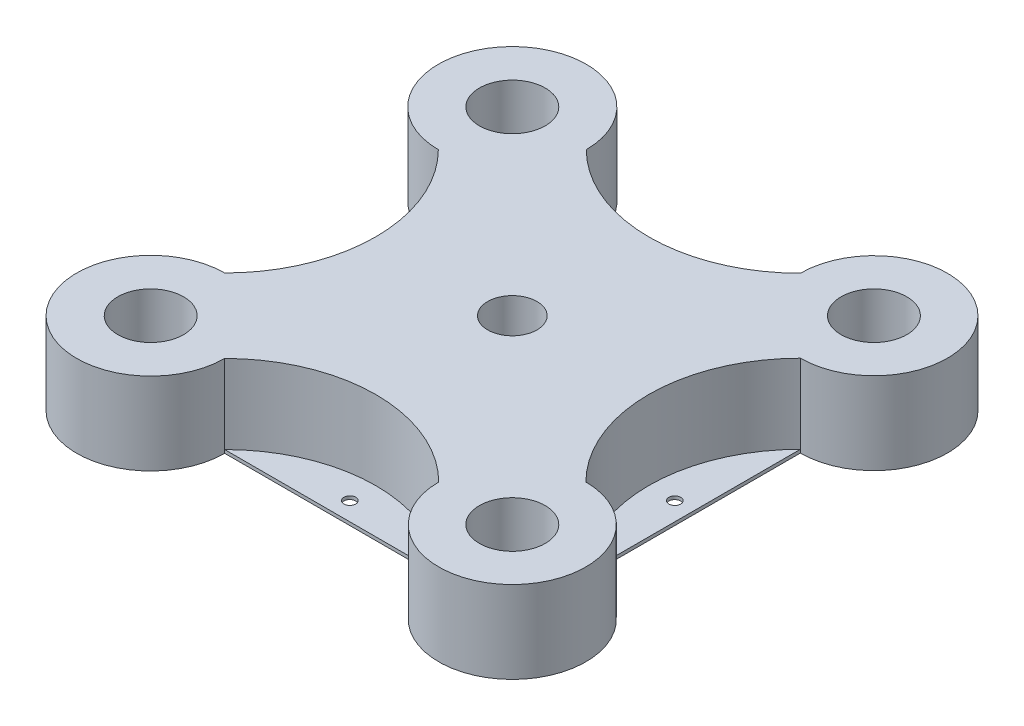
ISO-10303-21;
HEADER;
FILE_DESCRIPTION(('STEP AP214'),'2;1');
FILE_NAME('part.step','',(''),(''),'','','');
FILE_SCHEMA(('AUTOMOTIVE_DESIGN { 1 0 10303 214 1 1 1 1 }'));
ENDSEC;
DATA;
#1=APPLICATION_CONTEXT('core data for automotive mechanical design processes');
#2=APPLICATION_PROTOCOL_DEFINITION('international standard','automotive_design',2000,#1);
#3=PRODUCT_CONTEXT('',#1,'mechanical');
#4=PRODUCT('Part','Part','',(#3));
#5=PRODUCT_RELATED_PRODUCT_CATEGORY('part','',(#4));
#6=PRODUCT_DEFINITION_FORMATION('','',#4);
#7=PRODUCT_DEFINITION_CONTEXT('part definition',#1,'design');
#8=PRODUCT_DEFINITION('design','',#6,#7);
#9=PRODUCT_DEFINITION_SHAPE('','',#8);
#10=(LENGTH_UNIT() NAMED_UNIT(*) SI_UNIT(.MILLI.,.METRE.));
#11=(NAMED_UNIT(*) PLANE_ANGLE_UNIT() SI_UNIT($,.RADIAN.));
#12=(NAMED_UNIT(*) SI_UNIT($,.STERADIAN.) SOLID_ANGLE_UNIT());
#13=UNCERTAINTY_MEASURE_WITH_UNIT(LENGTH_MEASURE(1.E-05),#10,'distance_accuracy_value','');
#14=(GEOMETRIC_REPRESENTATION_CONTEXT(3) GLOBAL_UNCERTAINTY_ASSIGNED_CONTEXT((#13)) GLOBAL_UNIT_ASSIGNED_CONTEXT((#10,
#11,#12)) REPRESENTATION_CONTEXT('',''));
#15=CARTESIAN_POINT('',(0.,0.,0.));
#16=DIRECTION('',(0.,0.,1.));
#17=DIRECTION('',(1.,0.,0.));
#18=AXIS2_PLACEMENT_3D('',#15,#16,#17);
#19=CARTESIAN_POINT('',(550.,250.,0.));
#20=DIRECTION('',(1.,0.,0.));
#21=DIRECTION('',(0.,0.,-1.));
#22=AXIS2_PLACEMENT_3D('',#19,#20,#21);
#23=PLANE('',#22);
#24=DIRECTION('',(0.,-1.,0.));
#25=VECTOR('',#24,1.);
#26=CARTESIAN_POINT('',(550.,250.,-326.203305187064));
#27=LINE('',#26,#25);
#28=CARTESIAN_POINT('',(550.,10.0000000000001,-326.203305187064));
#29=VERTEX_POINT('',#28);
#30=CARTESIAN_POINT('',(550.,0.,-326.203305187064));
#31=VERTEX_POINT('',#30);
#32=EDGE_CURVE('E218',#29,#31,#27,.T.);
#33=ORIENTED_EDGE('',*,*,#32,.F.);
#34=DIRECTION('',(0.,0.,-1.));
#35=VECTOR('',#34,1.);
#36=CARTESIAN_POINT('',(550.,10.0000000000001,-326.203305187064));
#37=LINE('',#36,#35);
#38=CARTESIAN_POINT('',(550.,10.0000000000001,326.203305187064));
#39=VERTEX_POINT('',#38);
#40=EDGE_CURVE('E212',#39,#29,#37,.T.);
#41=ORIENTED_EDGE('',*,*,#40,.F.);
#42=DIRECTION('',(0.,-1.,0.));
#43=VECTOR('',#42,1.);
#44=CARTESIAN_POINT('',(550.,250.,326.203305187064));
#45=LINE('',#44,#43);
#46=CARTESIAN_POINT('',(550.,0.,326.203305187064));
#47=VERTEX_POINT('',#46);
#48=EDGE_CURVE('E207',#39,#47,#45,.T.);
#49=ORIENTED_EDGE('',*,*,#48,.T.);
#50=DIRECTION('',(0.,0.,1.));
#51=VECTOR('',#50,1.);
#52=CARTESIAN_POINT('',(550.,0.,0.));
#53=LINE('',#52,#51);
#54=EDGE_CURVE('E296',#31,#47,#53,.T.);
#55=ORIENTED_EDGE('',*,*,#54,.F.);
#56=EDGE_LOOP('',(#33,#41,#49,#55));
#57=FACE_BOUND('',#56,.T.);
#58=ADVANCED_FACE('F95',(#57),#23,.T.);
#59=CARTESIAN_POINT('',(0.,250.,-550.));
#60=DIRECTION('',(0.,0.,-1.));
#61=DIRECTION('',(-1.,0.,0.));
#62=AXIS2_PLACEMENT_3D('',#59,#60,#61);
#63=PLANE('',#62);
#64=DIRECTION('',(0.,-1.,0.));
#65=VECTOR('',#64,1.);
#66=CARTESIAN_POINT('',(-325.,250.,-550.));
#67=LINE('',#66,#65);
#68=CARTESIAN_POINT('',(-325.,10.0000000000001,-550.));
#69=VERTEX_POINT('',#68);
#70=CARTESIAN_POINT('',(-325.,0.,-550.));
#71=VERTEX_POINT('',#70);
#72=EDGE_CURVE('E325',#69,#71,#67,.T.);
#73=ORIENTED_EDGE('',*,*,#72,.F.);
#74=DIRECTION('',(-1.,0.,0.));
#75=VECTOR('',#74,1.);
#76=CARTESIAN_POINT('',(-325.,10.0000000000001,-550.));
#77=LINE('',#76,#75);
#78=CARTESIAN_POINT('',(326.203305187064,10.0000000000001,-550.));
#79=VERTEX_POINT('',#78);
#80=EDGE_CURVE('E337',#79,#69,#77,.T.);
#81=ORIENTED_EDGE('',*,*,#80,.F.);
#82=DIRECTION('',(0.,-1.,0.));
#83=VECTOR('',#82,1.);
#84=CARTESIAN_POINT('',(326.203305187064,250.,-550.));
#85=LINE('',#84,#83);
#86=CARTESIAN_POINT('',(326.203305187064,0.,-550.));
#87=VERTEX_POINT('',#86);
#88=EDGE_CURVE('E326',#79,#87,#85,.T.);
#89=ORIENTED_EDGE('',*,*,#88,.T.);
#90=DIRECTION('',(1.,0.,0.));
#91=VECTOR('',#90,1.);
#92=CARTESIAN_POINT('',(0.,0.,-550.));
#93=LINE('',#92,#91);
#94=EDGE_CURVE('E301',#71,#87,#93,.T.);
#95=ORIENTED_EDGE('',*,*,#94,.F.);
#96=EDGE_LOOP('',(#73,#81,#89,#95));
#97=FACE_BOUND('',#96,.T.);
#98=ADVANCED_FACE('F335',(#97),#63,.T.);
#99=CARTESIAN_POINT('',(550.,250.,550.));
#100=DIRECTION('',(0.,-1.,0.));
#101=DIRECTION('',(0.,0.,-1.));
#102=AXIS2_PLACEMENT_3D('',#99,#100,#101);
#103=CYLINDRICAL_SURFACE('',#102,100.);
#104=CARTESIAN_POINT('',(550.,250.,550.));
#105=DIRECTION('',(0.,1.,0.));
#106=DIRECTION('',(0.,0.,1.));
#107=AXIS2_PLACEMENT_3D('',#104,#105,#106);
#108=CIRCLE('',#107,100.);
#109=CARTESIAN_POINT('',(550.,250.,650.));
#110=VERTEX_POINT('',#109);
#111=EDGE_CURVE('E292',#110,#110,#108,.T.);
#112=ORIENTED_EDGE('',*,*,#111,.T.);
#113=EDGE_LOOP('',(#112));
#114=FACE_BOUND('',#113,.T.);
#115=CARTESIAN_POINT('',(550.,0.,550.));
#116=DIRECTION('',(0.,1.,0.));
#117=DIRECTION('',(0.,0.,1.));
#118=AXIS2_PLACEMENT_3D('',#115,#116,#117);
#119=CIRCLE('',#118,100.);
#120=CARTESIAN_POINT('',(550.,0.,650.));
#121=VERTEX_POINT('',#120);
#122=EDGE_CURVE('E277',#121,#121,#119,.T.);
#123=ORIENTED_EDGE('',*,*,#122,.F.);
#124=EDGE_LOOP('',(#123));
#125=FACE_BOUND('',#124,.T.);
#126=ADVANCED_FACE('F369',(#114,#125),#103,.F.);
#127=CARTESIAN_POINT('',(550.,250.,-550.));
#128=DIRECTION('',(0.,-1.,0.));
#129=DIRECTION('',(0.,0.,-1.));
#130=AXIS2_PLACEMENT_3D('',#127,#128,#129);
#131=CYLINDRICAL_SURFACE('',#130,100.);
#132=CARTESIAN_POINT('',(550.,250.,-550.));
#133=DIRECTION('',(0.,1.,0.));
#134=DIRECTION('',(0.,0.,1.));
#135=AXIS2_PLACEMENT_3D('',#132,#133,#134);
#136=CIRCLE('',#135,100.);
#137=CARTESIAN_POINT('',(550.,250.,-450.));
#138=VERTEX_POINT('',#137);
#139=EDGE_CURVE('E289',#138,#138,#136,.T.);
#140=ORIENTED_EDGE('',*,*,#139,.T.);
#141=EDGE_LOOP('',(#140));
#142=FACE_BOUND('',#141,.T.);
#143=CARTESIAN_POINT('',(550.,0.,-550.));
#144=DIRECTION('',(0.,1.,0.));
#145=DIRECTION('',(0.,0.,1.));
#146=AXIS2_PLACEMENT_3D('',#143,#144,#145);
#147=CIRCLE('',#146,100.);
#148=CARTESIAN_POINT('',(550.,0.,-450.));
#149=VERTEX_POINT('',#148);
#150=EDGE_CURVE('E315',#149,#149,#147,.T.);
#151=ORIENTED_EDGE('',*,*,#150,.F.);
#152=EDGE_LOOP('',(#151));
#153=FACE_BOUND('',#152,.T.);
#154=ADVANCED_FACE('F404',(#142,#153),#131,.F.);
#155=CARTESIAN_POINT('',(-550.,250.,-550.));
#156=DIRECTION('',(0.,-1.,0.));
#157=DIRECTION('',(0.,0.,-1.));
#158=AXIS2_PLACEMENT_3D('',#155,#156,#157);
#159=CYLINDRICAL_SURFACE('',#158,100.);
#160=CARTESIAN_POINT('',(-550.,250.,-550.));
#161=DIRECTION('',(0.,1.,0.));
#162=DIRECTION('',(0.,0.,1.));
#163=AXIS2_PLACEMENT_3D('',#160,#161,#162);
#164=CIRCLE('',#163,100.);
#165=CARTESIAN_POINT('',(-550.,250.,-450.));
#166=VERTEX_POINT('',#165);
#167=EDGE_CURVE('E286',#166,#166,#164,.T.);
#168=ORIENTED_EDGE('',*,*,#167,.T.);
#169=EDGE_LOOP('',(#168));
#170=FACE_BOUND('',#169,.T.);
#171=CARTESIAN_POINT('',(-550.,0.,-550.));
#172=DIRECTION('',(0.,1.,0.));
#173=DIRECTION('',(0.,0.,1.));
#174=AXIS2_PLACEMENT_3D('',#171,#172,#173);
#175=CIRCLE('',#174,100.);
#176=CARTESIAN_POINT('',(-550.,0.,-450.));
#177=VERTEX_POINT('',#176);
#178=EDGE_CURVE('E312',#177,#177,#175,.T.);
#179=ORIENTED_EDGE('',*,*,#178,.F.);
#180=EDGE_LOOP('',(#179));
#181=FACE_BOUND('',#180,.T.);
#182=ADVANCED_FACE('F408',(#170,#181),#159,.F.);
#183=CARTESIAN_POINT('',(0.,250.,0.));
#184=DIRECTION('',(0.,-1.,0.));
#185=DIRECTION('',(0.,0.,-1.));
#186=AXIS2_PLACEMENT_3D('',#183,#184,#185);
#187=CYLINDRICAL_SURFACE('',#186,75.);
#188=CARTESIAN_POINT('',(0.,250.,0.));
#189=DIRECTION('',(0.,1.,0.));
#190=DIRECTION('',(0.,0.,1.));
#191=AXIS2_PLACEMENT_3D('',#188,#189,#190);
#192=CIRCLE('',#191,75.);
#193=CARTESIAN_POINT('',(0.,250.,75.));
#194=VERTEX_POINT('',#193);
#195=EDGE_CURVE('E283',#194,#194,#192,.T.);
#196=ORIENTED_EDGE('',*,*,#195,.T.);
#197=EDGE_LOOP('',(#196));
#198=FACE_BOUND('',#197,.T.);
#199=CARTESIAN_POINT('',(0.,0.,0.));
#200=DIRECTION('',(0.,1.,0.));
#201=DIRECTION('',(0.,0.,1.));
#202=AXIS2_PLACEMENT_3D('',#199,#200,#201);
#203=CIRCLE('',#202,75.);
#204=CARTESIAN_POINT('',(0.,0.,75.));
#205=VERTEX_POINT('',#204);
#206=EDGE_CURVE('E309',#205,#205,#203,.T.);
#207=ORIENTED_EDGE('',*,*,#206,.F.);
#208=EDGE_LOOP('',(#207));
#209=FACE_BOUND('',#208,.T.);
#210=ADVANCED_FACE('F376',(#198,#209),#187,.F.);
#211=CARTESIAN_POINT('',(0.,250.,550.));
#212=DIRECTION('',(0.,0.,-1.));
#213=DIRECTION('',(-1.,0.,0.));
#214=AXIS2_PLACEMENT_3D('',#211,#212,#213);
#215=PLANE('',#214);
#216=DIRECTION('',(0.,-1.,0.));
#217=VECTOR('',#216,1.);
#218=CARTESIAN_POINT('',(326.203305187064,250.,550.));
#219=LINE('',#218,#217);
#220=CARTESIAN_POINT('',(326.203305187064,10.0000000000001,550.));
#221=VERTEX_POINT('',#220);
#222=CARTESIAN_POINT('',(326.203305187064,0.,550.));
#223=VERTEX_POINT('',#222);
#224=EDGE_CURVE('E206',#221,#223,#219,.T.);
#225=ORIENTED_EDGE('',*,*,#224,.F.);
#226=DIRECTION('',(1.,0.,0.));
#227=VECTOR('',#226,1.);
#228=CARTESIAN_POINT('',(-324.872993427457,10.0000000000001,550.));
#229=LINE('',#228,#227);
#230=CARTESIAN_POINT('',(-324.872993427457,10.0000000000001,550.));
#231=VERTEX_POINT('',#230);
#232=EDGE_CURVE('E258',#231,#221,#229,.T.);
#233=ORIENTED_EDGE('',*,*,#232,.F.);
#234=DIRECTION('',(0.,-1.,0.));
#235=VECTOR('',#234,1.);
#236=CARTESIAN_POINT('',(-324.872993427457,250.,550.));
#237=LINE('',#236,#235);
#238=CARTESIAN_POINT('',(-324.872993427457,0.,550.));
#239=VERTEX_POINT('',#238);
#240=EDGE_CURVE('E104',#231,#239,#237,.T.);
#241=ORIENTED_EDGE('',*,*,#240,.T.);
#242=DIRECTION('',(1.,0.,0.));
#243=VECTOR('',#242,1.);
#244=CARTESIAN_POINT('',(0.,0.,550.));
#245=LINE('',#244,#243);
#246=EDGE_CURVE('E240',#239,#223,#245,.T.);
#247=ORIENTED_EDGE('',*,*,#246,.T.);
#248=EDGE_LOOP('',(#225,#233,#241,#247));
#249=FACE_BOUND('',#248,.T.);
#250=ADVANCED_FACE('F255',(#249),#215,.F.);
#251=CARTESIAN_POINT('',(550.,250.,550.));
#252=DIRECTION('',(0.,-1.,0.));
#253=DIRECTION('',(0.,0.,-1.));
#254=AXIS2_PLACEMENT_3D('',#251,#252,#253);
#255=CYLINDRICAL_SURFACE('',#254,223.796694812936);
#256=CARTESIAN_POINT('',(550.,0.,550.));
#257=DIRECTION('',(0.,1.,0.));
#258=DIRECTION('',(0.,0.,1.));
#259=AXIS2_PLACEMENT_3D('',#256,#257,#258);
#260=CIRCLE('',#259,223.796694812936);
#261=EDGE_CURVE('E224',#223,#47,#260,.T.);
#262=ORIENTED_EDGE('',*,*,#261,.T.);
#263=ORIENTED_EDGE('',*,*,#48,.F.);
#264=CARTESIAN_POINT('',(550.,250.,326.203305187064));
#265=VERTEX_POINT('',#264);
#266=EDGE_CURVE('E195',#265,#39,#45,.T.);
#267=ORIENTED_EDGE('',*,*,#266,.F.);
#268=CARTESIAN_POINT('',(550.,250.,550.));
#269=DIRECTION('',(0.,1.,0.));
#270=DIRECTION('',(0.,0.,1.));
#271=AXIS2_PLACEMENT_3D('',#268,#269,#270);
#272=CIRCLE('',#271,223.796694812936);
#273=CARTESIAN_POINT('',(326.203305187064,250.,550.));
#274=VERTEX_POINT('',#273);
#275=EDGE_CURVE('E274',#274,#265,#272,.T.);
#276=ORIENTED_EDGE('',*,*,#275,.F.);
#277=EDGE_CURVE('E230',#274,#221,#219,.T.);
#278=ORIENTED_EDGE('',*,*,#277,.T.);
#279=ORIENTED_EDGE('',*,*,#224,.T.);
#280=EDGE_LOOP('',(#262,#263,#267,#276,#278,#279));
#281=FACE_BOUND('',#280,.T.);
#282=ADVANCED_FACE('F222',(#281),#255,.T.);
#283=CARTESIAN_POINT('',(550.,250.,-550.));
#284=DIRECTION('',(0.,-1.,0.));
#285=DIRECTION('',(0.,0.,-1.));
#286=AXIS2_PLACEMENT_3D('',#283,#284,#285);
#287=CYLINDRICAL_SURFACE('',#286,223.796694812936);
#288=CARTESIAN_POINT('',(550.,0.,-550.));
#289=DIRECTION('',(0.,1.,0.));
#290=DIRECTION('',(0.,0.,1.));
#291=AXIS2_PLACEMENT_3D('',#288,#289,#290);
#292=CIRCLE('',#291,223.796694812936);
#293=EDGE_CURVE('E298',#31,#87,#292,.T.);
#294=ORIENTED_EDGE('',*,*,#293,.T.);
#295=ORIENTED_EDGE('',*,*,#88,.F.);
#296=CARTESIAN_POINT('',(326.203305187064,250.,-550.));
#297=VERTEX_POINT('',#296);
#298=EDGE_CURVE('E327',#297,#79,#85,.T.);
#299=ORIENTED_EDGE('',*,*,#298,.F.);
#300=CARTESIAN_POINT('',(550.,250.,-550.));
#301=DIRECTION('',(0.,1.,0.));
#302=DIRECTION('',(0.,0.,1.));
#303=AXIS2_PLACEMENT_3D('',#300,#301,#302);
#304=CIRCLE('',#303,223.796694812936);
#305=CARTESIAN_POINT('',(550.,250.,-326.203305187064));
#306=VERTEX_POINT('',#305);
#307=EDGE_CURVE('E276',#306,#297,#304,.T.);
#308=ORIENTED_EDGE('',*,*,#307,.F.);
#309=EDGE_CURVE('E226',#306,#29,#27,.T.);
#310=ORIENTED_EDGE('',*,*,#309,.T.);
#311=ORIENTED_EDGE('',*,*,#32,.T.);
#312=EDGE_LOOP('',(#294,#295,#299,#308,#310,#311));
#313=FACE_BOUND('',#312,.T.);
#314=ADVANCED_FACE('F340',(#313),#287,.T.);
#315=CARTESIAN_POINT('',(-550.,250.,-550.));
#316=DIRECTION('',(0.,-1.,0.));
#317=DIRECTION('',(0.,0.,-1.));
#318=AXIS2_PLACEMENT_3D('',#315,#316,#317);
#319=CYLINDRICAL_SURFACE('',#318,225.);
#320=CARTESIAN_POINT('',(-550.,0.,-550.));
#321=DIRECTION('',(0.,1.,0.));
#322=DIRECTION('',(0.,0.,1.));
#323=AXIS2_PLACEMENT_3D('',#320,#321,#322);
#324=CIRCLE('',#323,225.);
#325=CARTESIAN_POINT('',(-550.,0.,-325.));
#326=VERTEX_POINT('',#325);
#327=EDGE_CURVE('E304',#71,#326,#324,.T.);
#328=ORIENTED_EDGE('',*,*,#327,.T.);
#329=DIRECTION('',(0.,-1.,0.));
#330=VECTOR('',#329,1.);
#331=CARTESIAN_POINT('',(-550.,250.,-325.));
#332=LINE('',#331,#330);
#333=CARTESIAN_POINT('',(-550.,10.0000000000001,-325.));
#334=VERTEX_POINT('',#333);
#335=EDGE_CURVE('E322',#334,#326,#332,.T.);
#336=ORIENTED_EDGE('',*,*,#335,.F.);
#337=CARTESIAN_POINT('',(-550.,250.,-325.));
#338=VERTEX_POINT('',#337);
#339=EDGE_CURVE('E323',#338,#334,#332,.T.);
#340=ORIENTED_EDGE('',*,*,#339,.F.);
#341=CARTESIAN_POINT('',(-550.,250.,-550.));
#342=DIRECTION('',(0.,1.,0.));
#343=DIRECTION('',(0.,0.,1.));
#344=AXIS2_PLACEMENT_3D('',#341,#342,#343);
#345=CIRCLE('',#344,225.);
#346=CARTESIAN_POINT('',(-325.,250.,-550.));
#347=VERTEX_POINT('',#346);
#348=EDGE_CURVE('E280',#347,#338,#345,.T.);
#349=ORIENTED_EDGE('',*,*,#348,.F.);
#350=EDGE_CURVE('E120',#347,#69,#67,.T.);
#351=ORIENTED_EDGE('',*,*,#350,.T.);
#352=ORIENTED_EDGE('',*,*,#72,.T.);
#353=EDGE_LOOP('',(#328,#336,#340,#349,#351,#352));
#354=FACE_BOUND('',#353,.T.);
#355=ADVANCED_FACE('F344',(#354),#319,.T.);
#356=CARTESIAN_POINT('',(-550.,250.,0.));
#357=DIRECTION('',(1.,0.,0.));
#358=DIRECTION('',(0.,0.,-1.));
#359=AXIS2_PLACEMENT_3D('',#356,#357,#358);
#360=PLANE('',#359);
#361=DIRECTION('',(0.,-1.,0.));
#362=VECTOR('',#361,1.);
#363=CARTESIAN_POINT('',(-550.,250.,324.872993427457));
#364=LINE('',#363,#362);
#365=CARTESIAN_POINT('',(-550.,10.0000000000001,324.872993427457));
#366=VERTEX_POINT('',#365);
#367=CARTESIAN_POINT('',(-550.,0.,324.872993427457));
#368=VERTEX_POINT('',#367);
#369=EDGE_CURVE('E154',#366,#368,#364,.T.);
#370=ORIENTED_EDGE('',*,*,#369,.F.);
#371=DIRECTION('',(0.,0.,1.));
#372=VECTOR('',#371,1.);
#373=CARTESIAN_POINT('',(-550.,10.0000000000001,-325.));
#374=LINE('',#373,#372);
#375=EDGE_CURVE('E111',#334,#366,#374,.T.);
#376=ORIENTED_EDGE('',*,*,#375,.F.);
#377=ORIENTED_EDGE('',*,*,#335,.T.);
#378=DIRECTION('',(0.,0.,1.));
#379=VECTOR('',#378,1.);
#380=CARTESIAN_POINT('',(-550.,0.,0.));
#381=LINE('',#380,#379);
#382=EDGE_CURVE('E307',#326,#368,#381,.T.);
#383=ORIENTED_EDGE('',*,*,#382,.T.);
#384=EDGE_LOOP('',(#370,#376,#377,#383));
#385=FACE_BOUND('',#384,.T.);
#386=ADVANCED_FACE('F400',(#385),#360,.F.);
#387=CARTESIAN_POINT('',(0.,0.,0.));
#388=DIRECTION('',(0.,1.,0.));
#389=DIRECTION('',(0.,0.,1.));
#390=AXIS2_PLACEMENT_3D('',#387,#388,#389);
#391=PLANE('',#390);
#392=CARTESIAN_POINT('',(494.284737224119,0.,0.0635032862713047));
#393=DIRECTION('',(0.,1.,0.));
#394=DIRECTION('',(0.,0.,-1.));
#395=AXIS2_PLACEMENT_3D('',#392,#393,#394);
#396=CIRCLE('',#395,18.);
#397=CARTESIAN_POINT('',(494.284737224119,0.,-17.9364967137287));
#398=VERTEX_POINT('',#397);
#399=EDGE_CURVE('E587',#398,#398,#396,.T.);
#400=ORIENTED_EDGE('',*,*,#399,.T.);
#401=EDGE_LOOP('',(#400));
#402=FACE_BOUND('',#401,.T.);
#403=CARTESIAN_POINT('',(0.0635032862661274,0.,-494.284737224119));
#404=DIRECTION('',(0.,1.,0.));
#405=DIRECTION('',(-1.,0.,0.));
#406=AXIS2_PLACEMENT_3D('',#403,#404,#405);
#407=CIRCLE('',#406,18.);
#408=CARTESIAN_POINT('',(-17.9364967137339,0.,-494.284737224118));
#409=VERTEX_POINT('',#408);
#410=EDGE_CURVE('E582',#409,#409,#407,.T.);
#411=ORIENTED_EDGE('',*,*,#410,.T.);
#412=EDGE_LOOP('',(#411));
#413=FACE_BOUND('',#412,.T.);
#414=CARTESIAN_POINT('',(-0.063503286269579,0.,494.284737224119));
#415=DIRECTION('',(0.,1.,0.));
#416=DIRECTION('',(1.,0.,0.));
#417=AXIS2_PLACEMENT_3D('',#414,#415,#416);
#418=CIRCLE('',#417,18.);
#419=CARTESIAN_POINT('',(17.9364967137304,0.,494.284737224119));
#420=VERTEX_POINT('',#419);
#421=EDGE_CURVE('E595',#420,#420,#418,.T.);
#422=ORIENTED_EDGE('',*,*,#421,.T.);
#423=EDGE_LOOP('',(#422));
#424=FACE_BOUND('',#423,.T.);
#425=CARTESIAN_POINT('',(-494.284737224119,0.,-0.0635032862713047));
#426=DIRECTION('',(0.,1.,0.));
#427=DIRECTION('',(0.,0.,1.));
#428=AXIS2_PLACEMENT_3D('',#425,#426,#427);
#429=CIRCLE('',#428,18.);
#430=CARTESIAN_POINT('',(-494.284737224119,0.,17.9364967137287));
#431=VERTEX_POINT('',#430);
#432=EDGE_CURVE('E269',#431,#431,#429,.T.);
#433=ORIENTED_EDGE('',*,*,#432,.T.);
#434=EDGE_LOOP('',(#433));
#435=FACE_BOUND('',#434,.T.);
#436=ORIENTED_EDGE('',*,*,#246,.F.);
#437=CARTESIAN_POINT('',(-550.,0.,550.));
#438=DIRECTION('',(0.,1.,0.));
#439=DIRECTION('',(0.,0.,1.));
#440=AXIS2_PLACEMENT_3D('',#437,#438,#439);
#441=CIRCLE('',#440,225.127006572543);
#442=EDGE_CURVE('E99',#368,#239,#441,.T.);
#443=ORIENTED_EDGE('',*,*,#442,.F.);
#444=ORIENTED_EDGE('',*,*,#382,.F.);
#445=ORIENTED_EDGE('',*,*,#327,.F.);
#446=ORIENTED_EDGE('',*,*,#94,.T.);
#447=ORIENTED_EDGE('',*,*,#293,.F.);
#448=ORIENTED_EDGE('',*,*,#54,.T.);
#449=ORIENTED_EDGE('',*,*,#261,.F.);
#450=EDGE_LOOP('',(#436,#443,#444,#445,#446,#447,#448,#449));
#451=FACE_BOUND('',#450,.T.);
#452=ORIENTED_EDGE('',*,*,#206,.T.);
#453=EDGE_LOOP('',(#452));
#454=FACE_BOUND('',#453,.T.);
#455=ORIENTED_EDGE('',*,*,#178,.T.);
#456=EDGE_LOOP('',(#455));
#457=FACE_BOUND('',#456,.T.);
#458=ORIENTED_EDGE('',*,*,#150,.T.);
#459=EDGE_LOOP('',(#458));
#460=FACE_BOUND('',#459,.T.);
#461=ORIENTED_EDGE('',*,*,#122,.T.);
#462=EDGE_LOOP('',(#461));
#463=FACE_BOUND('',#462,.T.);
#464=CARTESIAN_POINT('',(-550.,0.,550.));
#465=DIRECTION('',(0.,1.,0.));
#466=DIRECTION('',(0.,0.,1.));
#467=AXIS2_PLACEMENT_3D('',#464,#465,#466);
#468=CIRCLE('',#467,100.);
#469=CARTESIAN_POINT('',(-550.,0.,650.));
#470=VERTEX_POINT('',#469);
#471=EDGE_CURVE('E236',#470,#470,#468,.T.);
#472=ORIENTED_EDGE('',*,*,#471,.T.);
#473=EDGE_LOOP('',(#472));
#474=FACE_BOUND('',#473,.T.);
#475=ADVANCED_FACE('F251',(#402,#413,#424,#435,#451,#454,#457,#460,#463,#474),#391,.F.);
#476=CARTESIAN_POINT('',(0.,250.,0.));
#477=DIRECTION('',(0.,1.,0.));
#478=DIRECTION('',(0.,0.,1.));
#479=AXIS2_PLACEMENT_3D('',#476,#477,#478);
#480=PLANE('',#479);
#481=CARTESIAN_POINT('',(876.203305187065,250.,0.));
#482=DIRECTION('',(0.,1.,0.));
#483=DIRECTION('',(0.,0.,1.));
#484=AXIS2_PLACEMENT_3D('',#481,#482,#483);
#485=CIRCLE('',#484,461.321138286476);
#486=EDGE_CURVE('E201',#306,#265,#485,.T.);
#487=ORIENTED_EDGE('',*,*,#486,.F.);
#488=ORIENTED_EDGE('',*,*,#307,.T.);
#489=CARTESIAN_POINT('',(0.601652593531898,250.,-875.601652593533));
#490=DIRECTION('',(0.,1.,0.));
#491=DIRECTION('',(0.,0.,1.));
#492=AXIS2_PLACEMENT_3D('',#489,#490,#491);
#493=CIRCLE('',#492,460.470273028867);
#494=EDGE_CURVE('E261',#347,#297,#493,.T.);
#495=ORIENTED_EDGE('',*,*,#494,.F.);
#496=ORIENTED_EDGE('',*,*,#348,.T.);
#497=CARTESIAN_POINT('',(-874.936496713729,250.,-0.0635032862712492));
#498=DIRECTION('',(0.,1.,0.));
#499=DIRECTION('',(0.,0.,-1.));
#500=AXIS2_PLACEMENT_3D('',#497,#498,#499);
#501=CIRCLE('',#500,459.529600562556);
#502=CARTESIAN_POINT('',(-550.,250.,324.872993427457));
#503=VERTEX_POINT('',#502);
#504=EDGE_CURVE('E220',#503,#338,#501,.T.);
#505=ORIENTED_EDGE('',*,*,#504,.F.);
#506=CARTESIAN_POINT('',(-550.,250.,550.));
#507=DIRECTION('',(0.,1.,0.));
#508=DIRECTION('',(0.,0.,1.));
#509=AXIS2_PLACEMENT_3D('',#506,#507,#508);
#510=CIRCLE('',#509,225.127006572543);
#511=CARTESIAN_POINT('',(-324.872993427457,250.,550.));
#512=VERTEX_POINT('',#511);
#513=EDGE_CURVE('E238',#503,#512,#510,.T.);
#514=ORIENTED_EDGE('',*,*,#513,.T.);
#515=CARTESIAN_POINT('',(0.665155879803425,250.,875.538149307261));
#516=DIRECTION('',(0.,1.,0.));
#517=DIRECTION('',(0.,0.,-1.));
#518=AXIS2_PLACEMENT_3D('',#515,#516,#517);
#519=CIRCLE('',#518,460.380465820166);
#520=EDGE_CURVE('E160',#274,#512,#519,.T.);
#521=ORIENTED_EDGE('',*,*,#520,.F.);
#522=ORIENTED_EDGE('',*,*,#275,.T.);
#523=EDGE_LOOP('',(#487,#488,#495,#496,#505,#514,#521,#522));
#524=FACE_BOUND('',#523,.T.);
#525=ORIENTED_EDGE('',*,*,#195,.F.);
#526=EDGE_LOOP('',(#525));
#527=FACE_BOUND('',#526,.T.);
#528=ORIENTED_EDGE('',*,*,#167,.F.);
#529=EDGE_LOOP('',(#528));
#530=FACE_BOUND('',#529,.T.);
#531=ORIENTED_EDGE('',*,*,#139,.F.);
#532=EDGE_LOOP('',(#531));
#533=FACE_BOUND('',#532,.T.);
#534=ORIENTED_EDGE('',*,*,#111,.F.);
#535=EDGE_LOOP('',(#534));
#536=FACE_BOUND('',#535,.T.);
#537=CARTESIAN_POINT('',(-550.,250.,550.));
#538=DIRECTION('',(0.,1.,0.));
#539=DIRECTION('',(0.,0.,1.));
#540=AXIS2_PLACEMENT_3D('',#537,#538,#539);
#541=CIRCLE('',#540,100.);
#542=CARTESIAN_POINT('',(-550.,250.,650.));
#543=VERTEX_POINT('',#542);
#544=EDGE_CURVE('E233',#543,#543,#541,.T.);
#545=ORIENTED_EDGE('',*,*,#544,.F.);
#546=EDGE_LOOP('',(#545));
#547=FACE_BOUND('',#546,.T.);
#548=ADVANCED_FACE('F347',(#524,#527,#530,#533,#536,#547),#480,.T.);
#549=CARTESIAN_POINT('',(-550.,250.,550.));
#550=DIRECTION('',(0.,-1.,0.));
#551=DIRECTION('',(0.,0.,-1.));
#552=AXIS2_PLACEMENT_3D('',#549,#550,#551);
#553=CYLINDRICAL_SURFACE('',#552,100.);
#554=ORIENTED_EDGE('',*,*,#544,.T.);
#555=EDGE_LOOP('',(#554));
#556=FACE_BOUND('',#555,.T.);
#557=ORIENTED_EDGE('',*,*,#471,.F.);
#558=EDGE_LOOP('',(#557));
#559=FACE_BOUND('',#558,.T.);
#560=ADVANCED_FACE('F377',(#556,#559),#553,.F.);
#561=CARTESIAN_POINT('',(-550.,250.,550.));
#562=DIRECTION('',(0.,-1.,0.));
#563=DIRECTION('',(0.,0.,-1.));
#564=AXIS2_PLACEMENT_3D('',#561,#562,#563);
#565=CYLINDRICAL_SURFACE('',#564,225.127006572543);
#566=ORIENTED_EDGE('',*,*,#442,.T.);
#567=ORIENTED_EDGE('',*,*,#240,.F.);
#568=EDGE_CURVE('E12',#512,#231,#237,.T.);
#569=ORIENTED_EDGE('',*,*,#568,.F.);
#570=ORIENTED_EDGE('',*,*,#513,.F.);
#571=EDGE_CURVE('E320',#503,#366,#364,.T.);
#572=ORIENTED_EDGE('',*,*,#571,.T.);
#573=ORIENTED_EDGE('',*,*,#369,.T.);
#574=EDGE_LOOP('',(#566,#567,#569,#570,#572,#573));
#575=FACE_BOUND('',#574,.T.);
#576=ADVANCED_FACE('F97',(#575),#565,.T.);
#577=CARTESIAN_POINT('',(-874.936496713729,10.0000000000001,-0.0635032862712492));
#578=DIRECTION('',(0.,1.,0.));
#579=DIRECTION('',(0.,0.,1.));
#580=AXIS2_PLACEMENT_3D('',#577,#578,#579);
#581=CYLINDRICAL_SURFACE('',#580,459.529600562556);
#582=ORIENTED_EDGE('',*,*,#504,.T.);
#583=ORIENTED_EDGE('',*,*,#339,.T.);
#584=CARTESIAN_POINT('',(-874.936496713729,10.0000000000001,-0.0635032862712492));
#585=DIRECTION('',(0.,1.,0.));
#586=DIRECTION('',(0.,0.,-1.));
#587=AXIS2_PLACEMENT_3D('',#584,#585,#586);
#588=CIRCLE('',#587,459.529600562556);
#589=EDGE_CURVE('E270',#366,#334,#588,.T.);
#590=ORIENTED_EDGE('',*,*,#589,.F.);
#591=ORIENTED_EDGE('',*,*,#571,.F.);
#592=EDGE_LOOP('',(#582,#583,#590,#591));
#593=FACE_BOUND('',#592,.T.);
#594=ADVANCED_FACE('F380',(#593),#581,.F.);
#595=CARTESIAN_POINT('',(-874.936496713729,10.0000000000001,-0.0635032862712492));
#596=DIRECTION('',(0.,-1.,0.));
#597=DIRECTION('',(0.,0.,-1.));
#598=AXIS2_PLACEMENT_3D('',#595,#596,#597);
#599=PLANE('',#598);
#600=CARTESIAN_POINT('',(-494.284737224119,10.0000000000001,-0.0635032862713047));
#601=DIRECTION('',(0.,1.,0.));
#602=DIRECTION('',(0.,0.,1.));
#603=AXIS2_PLACEMENT_3D('',#600,#601,#602);
#604=CIRCLE('',#603,18.);
#605=CARTESIAN_POINT('',(-494.284737224119,10.0000000000001,17.9364967137287));
#606=VERTEX_POINT('',#605);
#607=EDGE_CURVE('E598',#606,#606,#604,.T.);
#608=ORIENTED_EDGE('',*,*,#607,.F.);
#609=EDGE_LOOP('',(#608));
#610=FACE_BOUND('',#609,.T.);
#611=ORIENTED_EDGE('',*,*,#589,.T.);
#612=ORIENTED_EDGE('',*,*,#375,.T.);
#613=EDGE_LOOP('',(#611,#612));
#614=FACE_BOUND('',#613,.T.);
#615=ADVANCED_FACE('F388',(#610,#614),#599,.F.);
#616=CARTESIAN_POINT('',(0.665155879803425,10.0000000000001,875.538149307261));
#617=DIRECTION('',(0.,1.,0.));
#618=DIRECTION('',(0.,0.,1.));
#619=AXIS2_PLACEMENT_3D('',#616,#617,#618);
#620=CYLINDRICAL_SURFACE('',#619,460.380465820166);
#621=ORIENTED_EDGE('',*,*,#520,.T.);
#622=ORIENTED_EDGE('',*,*,#568,.T.);
#623=CARTESIAN_POINT('',(0.665155879803425,10.0000000000001,875.538149307261));
#624=DIRECTION('',(0.,1.,0.));
#625=DIRECTION('',(0.,0.,-1.));
#626=AXIS2_PLACEMENT_3D('',#623,#624,#625);
#627=CIRCLE('',#626,460.380465820166);
#628=EDGE_CURVE('E262',#221,#231,#627,.T.);
#629=ORIENTED_EDGE('',*,*,#628,.F.);
#630=ORIENTED_EDGE('',*,*,#277,.F.);
#631=EDGE_LOOP('',(#621,#622,#629,#630));
#632=FACE_BOUND('',#631,.T.);
#633=ADVANCED_FACE('F361',(#632),#620,.F.);
#634=CARTESIAN_POINT('',(0.665155879803425,10.0000000000001,875.538149307261));
#635=DIRECTION('',(0.,-1.,0.));
#636=DIRECTION('',(0.,0.,-1.));
#637=AXIS2_PLACEMENT_3D('',#634,#635,#636);
#638=PLANE('',#637);
#639=CARTESIAN_POINT('',(-0.063503286269579,10.0000000000001,494.284737224119));
#640=DIRECTION('',(0.,1.,0.));
#641=DIRECTION('',(1.,0.,0.));
#642=AXIS2_PLACEMENT_3D('',#639,#640,#641);
#643=CIRCLE('',#642,18.);
#644=CARTESIAN_POINT('',(17.9364967137304,10.0000000000001,494.284737224119));
#645=VERTEX_POINT('',#644);
#646=EDGE_CURVE('E592',#645,#645,#643,.T.);
#647=ORIENTED_EDGE('',*,*,#646,.F.);
#648=EDGE_LOOP('',(#647));
#649=FACE_BOUND('',#648,.T.);
#650=ORIENTED_EDGE('',*,*,#628,.T.);
#651=ORIENTED_EDGE('',*,*,#232,.T.);
#652=EDGE_LOOP('',(#650,#651));
#653=FACE_BOUND('',#652,.T.);
#654=ADVANCED_FACE('F353',(#649,#653),#638,.F.);
#655=CARTESIAN_POINT('',(0.601652593531898,10.0000000000001,-875.601652593533));
#656=DIRECTION('',(0.,1.,0.));
#657=DIRECTION('',(0.,0.,1.));
#658=AXIS2_PLACEMENT_3D('',#655,#656,#657);
#659=CYLINDRICAL_SURFACE('',#658,460.470273028867);
#660=ORIENTED_EDGE('',*,*,#494,.T.);
#661=ORIENTED_EDGE('',*,*,#298,.T.);
#662=CARTESIAN_POINT('',(0.601652593531898,10.0000000000001,-875.601652593533));
#663=DIRECTION('',(0.,1.,0.));
#664=DIRECTION('',(0.,0.,1.));
#665=AXIS2_PLACEMENT_3D('',#662,#663,#664);
#666=CIRCLE('',#665,460.470273028867);
#667=EDGE_CURVE('E264',#69,#79,#666,.T.);
#668=ORIENTED_EDGE('',*,*,#667,.F.);
#669=ORIENTED_EDGE('',*,*,#350,.F.);
#670=EDGE_LOOP('',(#660,#661,#668,#669));
#671=FACE_BOUND('',#670,.T.);
#672=ADVANCED_FACE('F350',(#671),#659,.F.);
#673=CARTESIAN_POINT('',(0.601652593531898,10.0000000000001,-875.601652593533));
#674=DIRECTION('',(0.,1.,0.));
#675=DIRECTION('',(0.,0.,1.));
#676=AXIS2_PLACEMENT_3D('',#673,#674,#675);
#677=PLANE('',#676);
#678=CARTESIAN_POINT('',(0.0635032862661274,10.0000000000001,-494.284737224119));
#679=DIRECTION('',(0.,1.,0.));
#680=DIRECTION('',(-1.,0.,0.));
#681=AXIS2_PLACEMENT_3D('',#678,#679,#680);
#682=CIRCLE('',#681,18.);
#683=CARTESIAN_POINT('',(-17.9364967137339,10.0000000000001,-494.284737224118));
#684=VERTEX_POINT('',#683);
#685=EDGE_CURVE('E579',#684,#684,#682,.T.);
#686=ORIENTED_EDGE('',*,*,#685,.F.);
#687=EDGE_LOOP('',(#686));
#688=FACE_BOUND('',#687,.T.);
#689=ORIENTED_EDGE('',*,*,#667,.T.);
#690=ORIENTED_EDGE('',*,*,#80,.T.);
#691=EDGE_LOOP('',(#689,#690));
#692=FACE_BOUND('',#691,.T.);
#693=ADVANCED_FACE('F352',(#688,#692),#677,.T.);
#694=CARTESIAN_POINT('',(876.203305187065,10.0000000000001,0.));
#695=DIRECTION('',(0.,1.,0.));
#696=DIRECTION('',(0.,0.,1.));
#697=AXIS2_PLACEMENT_3D('',#694,#695,#696);
#698=CYLINDRICAL_SURFACE('',#697,461.321138286476);
#699=ORIENTED_EDGE('',*,*,#486,.T.);
#700=ORIENTED_EDGE('',*,*,#266,.T.);
#701=CARTESIAN_POINT('',(876.203305187065,10.0000000000001,0.));
#702=DIRECTION('',(0.,1.,0.));
#703=DIRECTION('',(0.,0.,1.));
#704=AXIS2_PLACEMENT_3D('',#701,#702,#703);
#705=CIRCLE('',#704,461.321138286476);
#706=EDGE_CURVE('E198',#29,#39,#705,.T.);
#707=ORIENTED_EDGE('',*,*,#706,.F.);
#708=ORIENTED_EDGE('',*,*,#309,.F.);
#709=EDGE_LOOP('',(#699,#700,#707,#708));
#710=FACE_BOUND('',#709,.T.);
#711=ADVANCED_FACE('F197',(#710),#698,.F.);
#712=CARTESIAN_POINT('',(876.203305187065,10.0000000000001,0.));
#713=DIRECTION('',(0.,1.,0.));
#714=DIRECTION('',(0.,0.,1.));
#715=AXIS2_PLACEMENT_3D('',#712,#713,#714);
#716=PLANE('',#715);
#717=CARTESIAN_POINT('',(494.284737224119,10.0000000000001,0.0635032862713047));
#718=DIRECTION('',(0.,1.,0.));
#719=DIRECTION('',(0.,0.,-1.));
#720=AXIS2_PLACEMENT_3D('',#717,#718,#719);
#721=CIRCLE('',#720,18.);
#722=CARTESIAN_POINT('',(494.284737224119,10.0000000000001,-17.9364967137287));
#723=VERTEX_POINT('',#722);
#724=EDGE_CURVE('E584',#723,#723,#721,.T.);
#725=ORIENTED_EDGE('',*,*,#724,.F.);
#726=EDGE_LOOP('',(#725));
#727=FACE_BOUND('',#726,.T.);
#728=ORIENTED_EDGE('',*,*,#706,.T.);
#729=ORIENTED_EDGE('',*,*,#40,.T.);
#730=EDGE_LOOP('',(#728,#729));
#731=FACE_BOUND('',#730,.T.);
#732=ADVANCED_FACE('F211',(#727,#731),#716,.T.);
#733=CARTESIAN_POINT('',(-494.284737224119,-230.,-0.0635032862713047));
#734=DIRECTION('',(0.,1.,0.));
#735=DIRECTION('',(0.,0.,1.));
#736=AXIS2_PLACEMENT_3D('',#733,#734,#735);
#737=CYLINDRICAL_SURFACE('',#736,18.);
#738=ORIENTED_EDGE('',*,*,#607,.T.);
#739=EDGE_LOOP('',(#738));
#740=FACE_BOUND('',#739,.T.);
#741=ORIENTED_EDGE('',*,*,#432,.F.);
#742=EDGE_LOOP('',(#741));
#743=FACE_BOUND('',#742,.T.);
#744=ADVANCED_FACE('F512',(#740,#743),#737,.F.);
#745=CARTESIAN_POINT('',(-0.063503286269579,-230.,494.284737224119));
#746=DIRECTION('',(0.,1.,0.));
#747=DIRECTION('',(1.,0.,0.));
#748=AXIS2_PLACEMENT_3D('',#745,#746,#747);
#749=CYLINDRICAL_SURFACE('',#748,18.);
#750=ORIENTED_EDGE('',*,*,#646,.T.);
#751=EDGE_LOOP('',(#750));
#752=FACE_BOUND('',#751,.T.);
#753=ORIENTED_EDGE('',*,*,#421,.F.);
#754=EDGE_LOOP('',(#753));
#755=FACE_BOUND('',#754,.T.);
#756=ADVANCED_FACE('F517',(#752,#755),#749,.F.);
#757=CARTESIAN_POINT('',(494.284737224119,-230.,0.0635032862713047));
#758=DIRECTION('',(0.,1.,0.));
#759=DIRECTION('',(0.,0.,-1.));
#760=AXIS2_PLACEMENT_3D('',#757,#758,#759);
#761=CYLINDRICAL_SURFACE('',#760,18.);
#762=ORIENTED_EDGE('',*,*,#724,.T.);
#763=EDGE_LOOP('',(#762));
#764=FACE_BOUND('',#763,.T.);
#765=ORIENTED_EDGE('',*,*,#399,.F.);
#766=EDGE_LOOP('',(#765));
#767=FACE_BOUND('',#766,.T.);
#768=ADVANCED_FACE('F552',(#764,#767),#761,.F.);
#769=CARTESIAN_POINT('',(0.0635032862661274,-230.,-494.284737224119));
#770=DIRECTION('',(0.,1.,0.));
#771=DIRECTION('',(-1.,0.,0.));
#772=AXIS2_PLACEMENT_3D('',#769,#770,#771);
#773=CYLINDRICAL_SURFACE('',#772,18.);
#774=ORIENTED_EDGE('',*,*,#685,.T.);
#775=EDGE_LOOP('',(#774));
#776=FACE_BOUND('',#775,.T.);
#777=ORIENTED_EDGE('',*,*,#410,.F.);
#778=EDGE_LOOP('',(#777));
#779=FACE_BOUND('',#778,.T.);
#780=ADVANCED_FACE('F562',(#776,#779),#773,.F.);
#781=CLOSED_SHELL('',(#58,#98,#126,#154,#182,#210,#250,#282,#314,#355,#386,#475,#548,#560,#576,
#594,#615,#633,#654,#672,#693,#711,#732,#744,#756,#768,#780));
#782=MANIFOLD_SOLID_BREP('B2',#781);
#783=ADVANCED_BREP_SHAPE_REPRESENTATION('',(#18,#782),#14);
#784=SHAPE_DEFINITION_REPRESENTATION(#9,#783);
ENDSEC;
END-ISO-10303-21;
